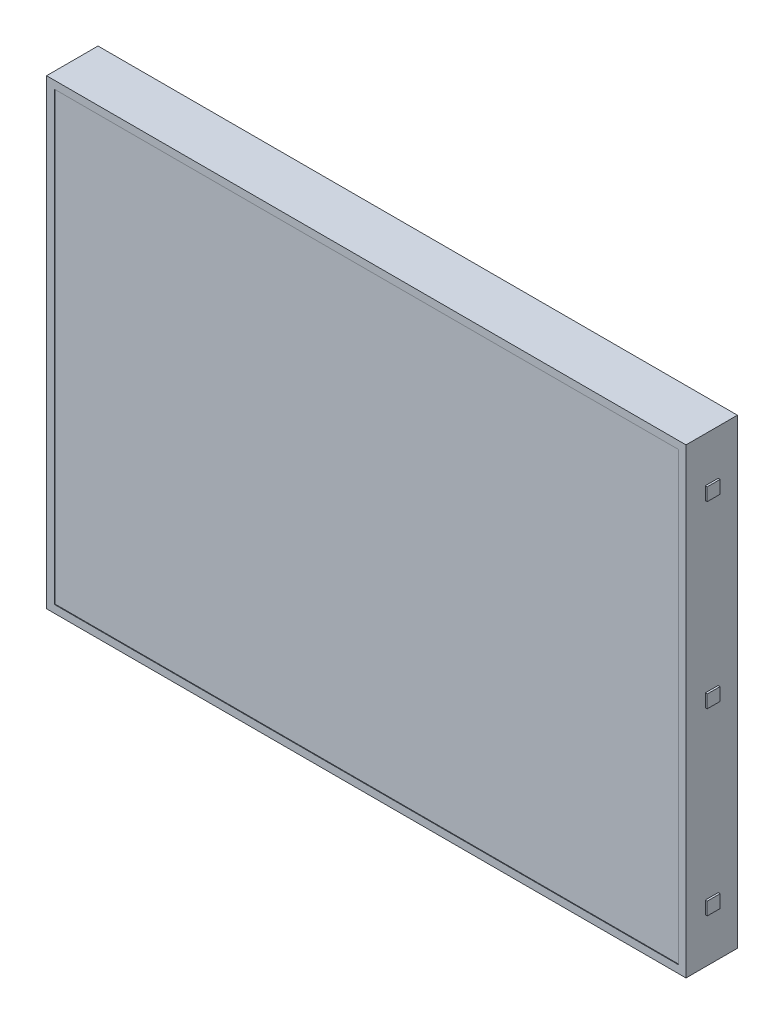
ISO-10303-21;
HEADER;
FILE_DESCRIPTION(('STEP AP214'),'2;1');
FILE_NAME('part.step','',(''),(''),'','','');
FILE_SCHEMA(('AUTOMOTIVE_DESIGN { 1 0 10303 214 1 1 1 1 }'));
ENDSEC;
DATA;
#1=APPLICATION_CONTEXT('core data for automotive mechanical design processes');
#2=APPLICATION_PROTOCOL_DEFINITION('international standard','automotive_design',2000,#1);
#3=PRODUCT_CONTEXT('',#1,'mechanical');
#4=PRODUCT('Part','Part','',(#3));
#5=PRODUCT_RELATED_PRODUCT_CATEGORY('part','',(#4));
#6=PRODUCT_DEFINITION_FORMATION('','',#4);
#7=PRODUCT_DEFINITION_CONTEXT('part definition',#1,'design');
#8=PRODUCT_DEFINITION('design','',#6,#7);
#9=PRODUCT_DEFINITION_SHAPE('','',#8);
#10=(LENGTH_UNIT() NAMED_UNIT(*) SI_UNIT(.MILLI.,.METRE.));
#11=(NAMED_UNIT(*) PLANE_ANGLE_UNIT() SI_UNIT($,.RADIAN.));
#12=(NAMED_UNIT(*) SI_UNIT($,.STERADIAN.) SOLID_ANGLE_UNIT());
#13=UNCERTAINTY_MEASURE_WITH_UNIT(LENGTH_MEASURE(1.E-05),#10,'distance_accuracy_value','');
#14=(GEOMETRIC_REPRESENTATION_CONTEXT(3) GLOBAL_UNCERTAINTY_ASSIGNED_CONTEXT((#13)) GLOBAL_UNIT_ASSIGNED_CONTEXT((#10,
#11,#12)) REPRESENTATION_CONTEXT('',''));
#15=CARTESIAN_POINT('',(0.,0.,0.));
#16=DIRECTION('',(0.,0.,1.));
#17=DIRECTION('',(1.,0.,0.));
#18=AXIS2_PLACEMENT_3D('',#15,#16,#17);
#19=CARTESIAN_POINT('',(-124.3,89.75,20.));
#20=DIRECTION('',(1.,0.,0.));
#21=DIRECTION('',(0.,1.,0.));
#22=AXIS2_PLACEMENT_3D('',#19,#20,#21);
#23=PLANE('',#22);
#24=CARTESIAN_POINT('',(-124.3,81.6317461319822,10.));
#25=DIRECTION('',(-1.,0.,0.));
#26=DIRECTION('',(0.,-1.,0.));
#27=AXIS2_PLACEMENT_3D('',#24,#25,#26);
#28=CIRCLE('',#27,2.75);
#29=CARTESIAN_POINT('',(-124.3,78.8817461319822,10.));
#30=VERTEX_POINT('',#29);
#31=EDGE_CURVE('E220',#30,#30,#28,.T.);
#32=ORIENTED_EDGE('',*,*,#31,.F.);
#33=EDGE_LOOP('',(#32));
#34=FACE_BOUND('',#33,.T.);
#35=DIRECTION('',(0.,-1.,0.));
#36=VECTOR('',#35,1.);
#37=CARTESIAN_POINT('',(-124.3,89.75,0.));
#38=LINE('',#37,#36);
#39=CARTESIAN_POINT('',(-124.3,89.75,0.));
#40=VERTEX_POINT('',#39);
#41=CARTESIAN_POINT('',(-124.3,-89.75,0.));
#42=VERTEX_POINT('',#41);
#43=EDGE_CURVE('E365',#40,#42,#38,.T.);
#44=ORIENTED_EDGE('',*,*,#43,.T.);
#45=DIRECTION('',(0.,0.,-1.));
#46=VECTOR('',#45,1.);
#47=CARTESIAN_POINT('',(-124.3,-89.75,20.));
#48=LINE('',#47,#46);
#49=CARTESIAN_POINT('',(-124.3,-89.75,20.));
#50=VERTEX_POINT('',#49);
#51=EDGE_CURVE('E412',#50,#42,#48,.T.);
#52=ORIENTED_EDGE('',*,*,#51,.F.);
#53=DIRECTION('',(0.,-1.,0.));
#54=VECTOR('',#53,1.);
#55=CARTESIAN_POINT('',(-124.3,89.75,20.));
#56=LINE('',#55,#54);
#57=CARTESIAN_POINT('',(-124.3,89.75,20.));
#58=VERTEX_POINT('',#57);
#59=EDGE_CURVE('E375',#58,#50,#56,.T.);
#60=ORIENTED_EDGE('',*,*,#59,.F.);
#61=DIRECTION('',(0.,0.,-1.));
#62=VECTOR('',#61,1.);
#63=CARTESIAN_POINT('',(-124.3,89.75,20.));
#64=LINE('',#63,#62);
#65=EDGE_CURVE('E389',#58,#40,#64,.T.);
#66=ORIENTED_EDGE('',*,*,#65,.T.);
#67=EDGE_LOOP('',(#44,#52,#60,#66));
#68=FACE_BOUND('',#67,.T.);
#69=ADVANCED_FACE('F51',(#34,#68),#23,.F.);
#70=CARTESIAN_POINT('',(124.3,-89.75,20.));
#71=DIRECTION('',(0.,1.,0.));
#72=DIRECTION('',(-1.,0.,0.));
#73=AXIS2_PLACEMENT_3D('',#70,#71,#72);
#74=PLANE('',#73);
#75=DIRECTION('',(1.,0.,0.));
#76=VECTOR('',#75,1.);
#77=CARTESIAN_POINT('',(124.3,-89.75,0.));
#78=LINE('',#77,#76);
#79=CARTESIAN_POINT('',(124.3,-89.75,0.));
#80=VERTEX_POINT('',#79);
#81=EDGE_CURVE('E393',#42,#80,#78,.T.);
#82=ORIENTED_EDGE('',*,*,#81,.T.);
#83=DIRECTION('',(0.,0.,-1.));
#84=VECTOR('',#83,1.);
#85=CARTESIAN_POINT('',(124.3,-89.75,20.));
#86=LINE('',#85,#84);
#87=CARTESIAN_POINT('',(124.3,-89.75,20.));
#88=VERTEX_POINT('',#87);
#89=EDGE_CURVE('E408',#88,#80,#86,.T.);
#90=ORIENTED_EDGE('',*,*,#89,.F.);
#91=DIRECTION('',(1.,0.,0.));
#92=VECTOR('',#91,1.);
#93=CARTESIAN_POINT('',(124.3,-89.75,20.));
#94=LINE('',#93,#92);
#95=EDGE_CURVE('E379',#50,#88,#94,.T.);
#96=ORIENTED_EDGE('',*,*,#95,.F.);
#97=ORIENTED_EDGE('',*,*,#51,.T.);
#98=EDGE_LOOP('',(#82,#90,#96,#97));
#99=FACE_BOUND('',#98,.T.);
#100=ADVANCED_FACE('F430',(#99),#74,.F.);
#101=CARTESIAN_POINT('',(124.3,89.75,20.));
#102=DIRECTION('',(-1.,0.,0.));
#103=DIRECTION('',(0.,-1.,0.));
#104=AXIS2_PLACEMENT_3D('',#101,#102,#103);
#105=PLANE('',#104);
#106=DIRECTION('',(0.,-1.,0.));
#107=VECTOR('',#106,1.);
#108=CARTESIAN_POINT('',(124.3,72.25,7.5));
#109=LINE('',#108,#107);
#110=CARTESIAN_POINT('',(124.3,72.25,7.5));
#111=VERTEX_POINT('',#110);
#112=CARTESIAN_POINT('',(124.3,67.25,7.5));
#113=VERTEX_POINT('',#112);
#114=EDGE_CURVE('E67',#111,#113,#109,.T.);
#115=ORIENTED_EDGE('',*,*,#114,.T.);
#116=DIRECTION('',(0.,0.,1.));
#117=VECTOR('',#116,1.);
#118=CARTESIAN_POINT('',(124.3,67.25,7.5));
#119=LINE('',#118,#117);
#120=CARTESIAN_POINT('',(124.3,67.25,12.5));
#121=VERTEX_POINT('',#120);
#122=EDGE_CURVE('E227',#113,#121,#119,.T.);
#123=ORIENTED_EDGE('',*,*,#122,.T.);
#124=DIRECTION('',(0.,-1.,0.));
#125=VECTOR('',#124,1.);
#126=CARTESIAN_POINT('',(124.3,72.25,12.5));
#127=LINE('',#126,#125);
#128=CARTESIAN_POINT('',(124.3,72.25,12.5));
#129=VERTEX_POINT('',#128);
#130=EDGE_CURVE('E206',#129,#121,#127,.T.);
#131=ORIENTED_EDGE('',*,*,#130,.F.);
#132=DIRECTION('',(0.,0.,1.));
#133=VECTOR('',#132,1.);
#134=CARTESIAN_POINT('',(124.3,72.25,7.5));
#135=LINE('',#134,#133);
#136=EDGE_CURVE('E72',#111,#129,#135,.T.);
#137=ORIENTED_EDGE('',*,*,#136,.F.);
#138=EDGE_LOOP('',(#115,#123,#131,#137));
#139=FACE_BOUND('',#138,.T.);
#140=DIRECTION('',(0.,-1.,0.));
#141=VECTOR('',#140,1.);
#142=CARTESIAN_POINT('',(124.3,2.50000000000002,7.49999999999999));
#143=LINE('',#142,#141);
#144=CARTESIAN_POINT('',(124.3,2.50000000000002,7.49999999999999));
#145=VERTEX_POINT('',#144);
#146=CARTESIAN_POINT('',(124.3,-2.49999999999999,7.49999999999999));
#147=VERTEX_POINT('',#146);
#148=EDGE_CURVE('E261',#145,#147,#143,.T.);
#149=ORIENTED_EDGE('',*,*,#148,.T.);
#150=DIRECTION('',(0.,0.,1.));
#151=VECTOR('',#150,1.);
#152=CARTESIAN_POINT('',(124.3,-2.49999999999998,7.49999999999999));
#153=LINE('',#152,#151);
#154=CARTESIAN_POINT('',(124.3,-2.49999999999998,12.5));
#155=VERTEX_POINT('',#154);
#156=EDGE_CURVE('E230',#147,#155,#153,.T.);
#157=ORIENTED_EDGE('',*,*,#156,.T.);
#158=DIRECTION('',(0.,-1.,0.));
#159=VECTOR('',#158,1.);
#160=CARTESIAN_POINT('',(124.3,2.50000000000002,12.5));
#161=LINE('',#160,#159);
#162=CARTESIAN_POINT('',(124.3,2.50000000000002,12.5));
#163=VERTEX_POINT('',#162);
#164=EDGE_CURVE('E269',#163,#155,#161,.T.);
#165=ORIENTED_EDGE('',*,*,#164,.F.);
#166=DIRECTION('',(0.,0.,1.));
#167=VECTOR('',#166,1.);
#168=CARTESIAN_POINT('',(124.3,2.50000000000002,7.49999999999999));
#169=LINE('',#168,#167);
#170=EDGE_CURVE('E264',#145,#163,#169,.T.);
#171=ORIENTED_EDGE('',*,*,#170,.F.);
#172=EDGE_LOOP('',(#149,#157,#165,#171));
#173=FACE_BOUND('',#172,.T.);
#174=DIRECTION('',(0.,-1.,0.));
#175=VECTOR('',#174,1.);
#176=CARTESIAN_POINT('',(124.3,-67.25,7.49999999999998));
#177=LINE('',#176,#175);
#178=CARTESIAN_POINT('',(124.3,-67.25,7.49999999999998));
#179=VERTEX_POINT('',#178);
#180=CARTESIAN_POINT('',(124.3,-72.25,7.49999999999998));
#181=VERTEX_POINT('',#180);
#182=EDGE_CURVE('E305',#179,#181,#177,.T.);
#183=ORIENTED_EDGE('',*,*,#182,.T.);
#184=DIRECTION('',(0.,0.,1.));
#185=VECTOR('',#184,1.);
#186=CARTESIAN_POINT('',(124.3,-72.25,7.49999999999998));
#187=LINE('',#186,#185);
#188=CARTESIAN_POINT('',(124.3,-72.25,12.5));
#189=VERTEX_POINT('',#188);
#190=EDGE_CURVE('E260',#181,#189,#187,.T.);
#191=ORIENTED_EDGE('',*,*,#190,.T.);
#192=DIRECTION('',(0.,-1.,0.));
#193=VECTOR('',#192,1.);
#194=CARTESIAN_POINT('',(124.3,-67.25,12.5));
#195=LINE('',#194,#193);
#196=CARTESIAN_POINT('',(124.3,-67.25,12.5));
#197=VERTEX_POINT('',#196);
#198=EDGE_CURVE('E313',#197,#189,#195,.T.);
#199=ORIENTED_EDGE('',*,*,#198,.F.);
#200=DIRECTION('',(0.,0.,1.));
#201=VECTOR('',#200,1.);
#202=CARTESIAN_POINT('',(124.3,-67.25,7.49999999999998));
#203=LINE('',#202,#201);
#204=EDGE_CURVE('E308',#179,#197,#203,.T.);
#205=ORIENTED_EDGE('',*,*,#204,.F.);
#206=EDGE_LOOP('',(#183,#191,#199,#205));
#207=FACE_BOUND('',#206,.T.);
#208=DIRECTION('',(0.,1.,0.));
#209=VECTOR('',#208,1.);
#210=CARTESIAN_POINT('',(124.3,89.75,0.));
#211=LINE('',#210,#209);
#212=CARTESIAN_POINT('',(124.3,89.75,0.));
#213=VERTEX_POINT('',#212);
#214=EDGE_CURVE('E396',#80,#213,#211,.T.);
#215=ORIENTED_EDGE('',*,*,#214,.T.);
#216=DIRECTION('',(0.,0.,-1.));
#217=VECTOR('',#216,1.);
#218=CARTESIAN_POINT('',(124.3,89.75,20.));
#219=LINE('',#218,#217);
#220=CARTESIAN_POINT('',(124.3,89.75,20.));
#221=VERTEX_POINT('',#220);
#222=EDGE_CURVE('E404',#221,#213,#219,.T.);
#223=ORIENTED_EDGE('',*,*,#222,.F.);
#224=DIRECTION('',(0.,1.,0.));
#225=VECTOR('',#224,1.);
#226=CARTESIAN_POINT('',(124.3,89.75,20.));
#227=LINE('',#226,#225);
#228=EDGE_CURVE('E383',#88,#221,#227,.T.);
#229=ORIENTED_EDGE('',*,*,#228,.F.);
#230=ORIENTED_EDGE('',*,*,#89,.T.);
#231=EDGE_LOOP('',(#215,#223,#229,#230));
#232=FACE_BOUND('',#231,.T.);
#233=ADVANCED_FACE('F435',(#139,#173,#207,#232),#105,.F.);
#234=CARTESIAN_POINT('',(124.3,89.75,20.));
#235=DIRECTION('',(0.,-1.,0.));
#236=DIRECTION('',(1.,0.,0.));
#237=AXIS2_PLACEMENT_3D('',#234,#235,#236);
#238=PLANE('',#237);
#239=DIRECTION('',(-1.,0.,0.));
#240=VECTOR('',#239,1.);
#241=CARTESIAN_POINT('',(124.3,89.75,0.));
#242=LINE('',#241,#240);
#243=EDGE_CURVE('E380',#213,#40,#242,.T.);
#244=ORIENTED_EDGE('',*,*,#243,.T.);
#245=ORIENTED_EDGE('',*,*,#65,.F.);
#246=DIRECTION('',(-1.,0.,0.));
#247=VECTOR('',#246,1.);
#248=CARTESIAN_POINT('',(124.3,89.75,20.));
#249=LINE('',#248,#247);
#250=EDGE_CURVE('E386',#221,#58,#249,.T.);
#251=ORIENTED_EDGE('',*,*,#250,.F.);
#252=ORIENTED_EDGE('',*,*,#222,.T.);
#253=EDGE_LOOP('',(#244,#245,#251,#252));
#254=FACE_BOUND('',#253,.T.);
#255=ADVANCED_FACE('F443',(#254),#238,.F.);
#256=CARTESIAN_POINT('',(0.,0.,20.));
#257=DIRECTION('',(0.,0.,-1.));
#258=DIRECTION('',(-1.,0.,0.));
#259=AXIS2_PLACEMENT_3D('',#256,#257,#258);
#260=PLANE('',#259);
#261=DIRECTION('',(1.,0.,0.));
#262=VECTOR('',#261,1.);
#263=CARTESIAN_POINT('',(121.3,-86.75,20.));
#264=LINE('',#263,#262);
#265=CARTESIAN_POINT('',(-121.3,-86.75,20.));
#266=VERTEX_POINT('',#265);
#267=CARTESIAN_POINT('',(121.3,-86.75,20.));
#268=VERTEX_POINT('',#267);
#269=EDGE_CURVE('E351',#266,#268,#264,.T.);
#270=ORIENTED_EDGE('',*,*,#269,.F.);
#271=DIRECTION('',(0.,-1.,0.));
#272=VECTOR('',#271,1.);
#273=CARTESIAN_POINT('',(-121.3,86.75,20.));
#274=LINE('',#273,#272);
#275=CARTESIAN_POINT('',(-121.3,86.75,20.));
#276=VERTEX_POINT('',#275);
#277=EDGE_CURVE('E237',#276,#266,#274,.T.);
#278=ORIENTED_EDGE('',*,*,#277,.F.);
#279=DIRECTION('',(-1.,0.,0.));
#280=VECTOR('',#279,1.);
#281=CARTESIAN_POINT('',(121.3,86.75,20.));
#282=LINE('',#281,#280);
#283=CARTESIAN_POINT('',(121.3,86.75,20.));
#284=VERTEX_POINT('',#283);
#285=EDGE_CURVE('E336',#284,#276,#282,.T.);
#286=ORIENTED_EDGE('',*,*,#285,.F.);
#287=DIRECTION('',(0.,1.,0.));
#288=VECTOR('',#287,1.);
#289=CARTESIAN_POINT('',(121.3,86.75,20.));
#290=LINE('',#289,#288);
#291=EDGE_CURVE('E355',#268,#284,#290,.T.);
#292=ORIENTED_EDGE('',*,*,#291,.F.);
#293=EDGE_LOOP('',(#270,#278,#286,#292));
#294=FACE_BOUND('',#293,.T.);
#295=ORIENTED_EDGE('',*,*,#59,.T.);
#296=ORIENTED_EDGE('',*,*,#95,.T.);
#297=ORIENTED_EDGE('',*,*,#228,.T.);
#298=ORIENTED_EDGE('',*,*,#250,.T.);
#299=EDGE_LOOP('',(#295,#296,#297,#298));
#300=FACE_BOUND('',#299,.T.);
#301=ADVANCED_FACE('F446',(#294,#300),#260,.F.);
#302=CARTESIAN_POINT('',(0.,0.,0.));
#303=DIRECTION('',(0.,0.,-1.));
#304=DIRECTION('',(-1.,0.,0.));
#305=AXIS2_PLACEMENT_3D('',#302,#303,#304);
#306=PLANE('',#305);
#307=ORIENTED_EDGE('',*,*,#43,.F.);
#308=ORIENTED_EDGE('',*,*,#243,.F.);
#309=ORIENTED_EDGE('',*,*,#214,.F.);
#310=ORIENTED_EDGE('',*,*,#81,.F.);
#311=EDGE_LOOP('',(#307,#308,#309,#310));
#312=FACE_BOUND('',#311,.T.);
#313=ADVANCED_FACE('F448',(#312),#306,.T.);
#314=CARTESIAN_POINT('',(-121.3,86.75,19.75));
#315=DIRECTION('',(-1.,0.,0.));
#316=DIRECTION('',(0.,0.,1.));
#317=AXIS2_PLACEMENT_3D('',#314,#315,#316);
#318=PLANE('',#317);
#319=ORIENTED_EDGE('',*,*,#277,.T.);
#320=DIRECTION('',(0.,0.,1.));
#321=VECTOR('',#320,1.);
#322=CARTESIAN_POINT('',(-121.3,-86.75,19.75));
#323=LINE('',#322,#321);
#324=CARTESIAN_POINT('',(-121.3,-86.75,19.75));
#325=VERTEX_POINT('',#324);
#326=EDGE_CURVE('E348',#325,#266,#323,.T.);
#327=ORIENTED_EDGE('',*,*,#326,.F.);
#328=DIRECTION('',(0.,-1.,0.));
#329=VECTOR('',#328,1.);
#330=CARTESIAN_POINT('',(-121.3,86.75,19.75));
#331=LINE('',#330,#329);
#332=CARTESIAN_POINT('',(-121.3,86.75,19.75));
#333=VERTEX_POINT('',#332);
#334=EDGE_CURVE('E331',#333,#325,#331,.T.);
#335=ORIENTED_EDGE('',*,*,#334,.F.);
#336=DIRECTION('',(0.,0.,1.));
#337=VECTOR('',#336,1.);
#338=CARTESIAN_POINT('',(-121.3,86.75,19.75));
#339=LINE('',#338,#337);
#340=EDGE_CURVE('E362',#333,#276,#339,.T.);
#341=ORIENTED_EDGE('',*,*,#340,.T.);
#342=EDGE_LOOP('',(#319,#327,#335,#341));
#343=FACE_BOUND('',#342,.T.);
#344=ADVANCED_FACE('F451',(#343),#318,.F.);
#345=CARTESIAN_POINT('',(121.3,86.75,19.75));
#346=DIRECTION('',(0.,1.,0.));
#347=DIRECTION('',(0.,0.,1.));
#348=AXIS2_PLACEMENT_3D('',#345,#346,#347);
#349=PLANE('',#348);
#350=ORIENTED_EDGE('',*,*,#285,.T.);
#351=ORIENTED_EDGE('',*,*,#340,.F.);
#352=DIRECTION('',(-1.,0.,0.));
#353=VECTOR('',#352,1.);
#354=CARTESIAN_POINT('',(121.3,86.75,19.75));
#355=LINE('',#354,#353);
#356=CARTESIAN_POINT('',(121.3,86.75,19.75));
#357=VERTEX_POINT('',#356);
#358=EDGE_CURVE('E344',#357,#333,#355,.T.);
#359=ORIENTED_EDGE('',*,*,#358,.F.);
#360=DIRECTION('',(0.,0.,1.));
#361=VECTOR('',#360,1.);
#362=CARTESIAN_POINT('',(121.3,86.75,19.75));
#363=LINE('',#362,#361);
#364=EDGE_CURVE('E366',#357,#284,#363,.T.);
#365=ORIENTED_EDGE('',*,*,#364,.T.);
#366=EDGE_LOOP('',(#350,#351,#359,#365));
#367=FACE_BOUND('',#366,.T.);
#368=ADVANCED_FACE('F458',(#367),#349,.F.);
#369=CARTESIAN_POINT('',(121.3,86.75,19.75));
#370=DIRECTION('',(1.,0.,0.));
#371=DIRECTION('',(0.,0.,-1.));
#372=AXIS2_PLACEMENT_3D('',#369,#370,#371);
#373=PLANE('',#372);
#374=ORIENTED_EDGE('',*,*,#291,.T.);
#375=ORIENTED_EDGE('',*,*,#364,.F.);
#376=DIRECTION('',(0.,1.,0.));
#377=VECTOR('',#376,1.);
#378=CARTESIAN_POINT('',(121.3,86.75,19.75));
#379=LINE('',#378,#377);
#380=CARTESIAN_POINT('',(121.3,-86.75,19.75));
#381=VERTEX_POINT('',#380);
#382=EDGE_CURVE('E340',#381,#357,#379,.T.);
#383=ORIENTED_EDGE('',*,*,#382,.F.);
#384=DIRECTION('',(0.,0.,1.));
#385=VECTOR('',#384,1.);
#386=CARTESIAN_POINT('',(121.3,-86.75,19.75));
#387=LINE('',#386,#385);
#388=EDGE_CURVE('E369',#381,#268,#387,.T.);
#389=ORIENTED_EDGE('',*,*,#388,.T.);
#390=EDGE_LOOP('',(#374,#375,#383,#389));
#391=FACE_BOUND('',#390,.T.);
#392=ADVANCED_FACE('F464',(#391),#373,.F.);
#393=CARTESIAN_POINT('',(121.3,-86.75,19.75));
#394=DIRECTION('',(0.,-1.,0.));
#395=DIRECTION('',(0.,0.,-1.));
#396=AXIS2_PLACEMENT_3D('',#393,#394,#395);
#397=PLANE('',#396);
#398=ORIENTED_EDGE('',*,*,#269,.T.);
#399=ORIENTED_EDGE('',*,*,#388,.F.);
#400=DIRECTION('',(1.,0.,0.));
#401=VECTOR('',#400,1.);
#402=CARTESIAN_POINT('',(121.3,-86.75,19.75));
#403=LINE('',#402,#401);
#404=EDGE_CURVE('E335',#325,#381,#403,.T.);
#405=ORIENTED_EDGE('',*,*,#404,.F.);
#406=ORIENTED_EDGE('',*,*,#326,.T.);
#407=EDGE_LOOP('',(#398,#399,#405,#406));
#408=FACE_BOUND('',#407,.T.);
#409=ADVANCED_FACE('F460',(#408),#397,.F.);
#410=CARTESIAN_POINT('',(0.,0.,19.75));
#411=DIRECTION('',(0.,0.,-1.));
#412=DIRECTION('',(-1.,0.,0.));
#413=AXIS2_PLACEMENT_3D('',#410,#411,#412);
#414=PLANE('',#413);
#415=ORIENTED_EDGE('',*,*,#334,.T.);
#416=ORIENTED_EDGE('',*,*,#404,.T.);
#417=ORIENTED_EDGE('',*,*,#382,.T.);
#418=ORIENTED_EDGE('',*,*,#358,.T.);
#419=EDGE_LOOP('',(#415,#416,#417,#418));
#420=FACE_BOUND('',#419,.T.);
#421=ADVANCED_FACE('F463',(#420),#414,.F.);
#422=CARTESIAN_POINT('',(125.05,-72.25,7.49999999999998));
#423=DIRECTION('',(0.,-1.,0.));
#424=DIRECTION('',(1.,0.,0.));
#425=AXIS2_PLACEMENT_3D('',#422,#423,#424);
#426=PLANE('',#425);
#427=ORIENTED_EDGE('',*,*,#190,.F.);
#428=DIRECTION('',(-1.,0.,0.));
#429=VECTOR('',#428,1.);
#430=CARTESIAN_POINT('',(125.05,-72.25,7.49999999999998));
#431=LINE('',#430,#429);
#432=CARTESIAN_POINT('',(125.05,-72.25,7.49999999999998));
#433=VERTEX_POINT('',#432);
#434=EDGE_CURVE('E300',#433,#181,#431,.T.);
#435=ORIENTED_EDGE('',*,*,#434,.F.);
#436=DIRECTION('',(0.,0.,1.));
#437=VECTOR('',#436,1.);
#438=CARTESIAN_POINT('',(125.05,-72.25,7.49999999999998));
#439=LINE('',#438,#437);
#440=CARTESIAN_POINT('',(125.05,-72.25,12.5));
#441=VERTEX_POINT('',#440);
#442=EDGE_CURVE('E309',#433,#441,#439,.T.);
#443=ORIENTED_EDGE('',*,*,#442,.T.);
#444=DIRECTION('',(-1.,0.,0.));
#445=VECTOR('',#444,1.);
#446=CARTESIAN_POINT('',(125.05,-72.25,12.5));
#447=LINE('',#446,#445);
#448=EDGE_CURVE('E287',#441,#189,#447,.T.);
#449=ORIENTED_EDGE('',*,*,#448,.T.);
#450=EDGE_LOOP('',(#427,#435,#443,#449));
#451=FACE_BOUND('',#450,.T.);
#452=ADVANCED_FACE('F474',(#451),#426,.T.);
#453=CARTESIAN_POINT('',(125.05,-67.25,7.49999999999998));
#454=DIRECTION('',(0.,0.,-1.));
#455=DIRECTION('',(0.,1.,0.));
#456=AXIS2_PLACEMENT_3D('',#453,#454,#455);
#457=PLANE('',#456);
#458=ORIENTED_EDGE('',*,*,#182,.F.);
#459=DIRECTION('',(-1.,0.,0.));
#460=VECTOR('',#459,1.);
#461=CARTESIAN_POINT('',(125.05,-67.25,7.49999999999998));
#462=LINE('',#461,#460);
#463=CARTESIAN_POINT('',(125.05,-67.25,7.49999999999998));
#464=VERTEX_POINT('',#463);
#465=EDGE_CURVE('E296',#464,#179,#462,.T.);
#466=ORIENTED_EDGE('',*,*,#465,.F.);
#467=DIRECTION('',(0.,-1.,0.));
#468=VECTOR('',#467,1.);
#469=CARTESIAN_POINT('',(125.05,-67.25,7.49999999999998));
#470=LINE('',#469,#468);
#471=EDGE_CURVE('E291',#464,#433,#470,.T.);
#472=ORIENTED_EDGE('',*,*,#471,.T.);
#473=ORIENTED_EDGE('',*,*,#434,.T.);
#474=EDGE_LOOP('',(#458,#466,#472,#473));
#475=FACE_BOUND('',#474,.T.);
#476=ADVANCED_FACE('F482',(#475),#457,.T.);
#477=CARTESIAN_POINT('',(125.05,-67.25,7.49999999999998));
#478=DIRECTION('',(0.,-1.,0.));
#479=DIRECTION('',(1.,0.,0.));
#480=AXIS2_PLACEMENT_3D('',#477,#478,#479);
#481=PLANE('',#480);
#482=ORIENTED_EDGE('',*,*,#204,.T.);
#483=DIRECTION('',(-1.,0.,0.));
#484=VECTOR('',#483,1.);
#485=CARTESIAN_POINT('',(125.05,-67.25,12.5));
#486=LINE('',#485,#484);
#487=CARTESIAN_POINT('',(125.05,-67.25,12.5));
#488=VERTEX_POINT('',#487);
#489=EDGE_CURVE('E292',#488,#197,#486,.T.);
#490=ORIENTED_EDGE('',*,*,#489,.F.);
#491=DIRECTION('',(0.,0.,1.));
#492=VECTOR('',#491,1.);
#493=CARTESIAN_POINT('',(125.05,-67.25,7.49999999999998));
#494=LINE('',#493,#492);
#495=EDGE_CURVE('E322',#464,#488,#494,.T.);
#496=ORIENTED_EDGE('',*,*,#495,.F.);
#497=ORIENTED_EDGE('',*,*,#465,.T.);
#498=EDGE_LOOP('',(#482,#490,#496,#497));
#499=FACE_BOUND('',#498,.T.);
#500=ADVANCED_FACE('F485',(#499),#481,.F.);
#501=CARTESIAN_POINT('',(125.05,-67.25,12.5));
#502=DIRECTION('',(0.,0.,-1.));
#503=DIRECTION('',(-1.,0.,0.));
#504=AXIS2_PLACEMENT_3D('',#501,#502,#503);
#505=PLANE('',#504);
#506=ORIENTED_EDGE('',*,*,#198,.T.);
#507=ORIENTED_EDGE('',*,*,#448,.F.);
#508=DIRECTION('',(0.,-1.,0.));
#509=VECTOR('',#508,1.);
#510=CARTESIAN_POINT('',(125.05,-67.25,12.5));
#511=LINE('',#510,#509);
#512=EDGE_CURVE('E325',#488,#441,#511,.T.);
#513=ORIENTED_EDGE('',*,*,#512,.F.);
#514=ORIENTED_EDGE('',*,*,#489,.T.);
#515=EDGE_LOOP('',(#506,#507,#513,#514));
#516=FACE_BOUND('',#515,.T.);
#517=ADVANCED_FACE('F480',(#516),#505,.F.);
#518=CARTESIAN_POINT('',(125.05,0.,0.));
#519=DIRECTION('',(1.,0.,0.));
#520=DIRECTION('',(0.,0.,-1.));
#521=AXIS2_PLACEMENT_3D('',#518,#519,#520);
#522=PLANE('',#521);
#523=ORIENTED_EDGE('',*,*,#442,.F.);
#524=ORIENTED_EDGE('',*,*,#471,.F.);
#525=ORIENTED_EDGE('',*,*,#495,.T.);
#526=ORIENTED_EDGE('',*,*,#512,.T.);
#527=EDGE_LOOP('',(#523,#524,#525,#526));
#528=FACE_BOUND('',#527,.T.);
#529=ADVANCED_FACE('F476',(#528),#522,.T.);
#530=CARTESIAN_POINT('',(125.05,-2.49999999999998,7.49999999999999));
#531=DIRECTION('',(0.,-1.,0.));
#532=DIRECTION('',(1.,0.,0.));
#533=AXIS2_PLACEMENT_3D('',#530,#531,#532);
#534=PLANE('',#533);
#535=ORIENTED_EDGE('',*,*,#156,.F.);
#536=DIRECTION('',(-1.,0.,0.));
#537=VECTOR('',#536,1.);
#538=CARTESIAN_POINT('',(125.05,-2.49999999999998,7.49999999999999));
#539=LINE('',#538,#537);
#540=CARTESIAN_POINT('',(125.05,-2.49999999999998,7.49999999999999));
#541=VERTEX_POINT('',#540);
#542=EDGE_CURVE('E256',#541,#147,#539,.T.);
#543=ORIENTED_EDGE('',*,*,#542,.F.);
#544=DIRECTION('',(0.,0.,1.));
#545=VECTOR('',#544,1.);
#546=CARTESIAN_POINT('',(125.05,-2.49999999999998,7.49999999999999));
#547=LINE('',#546,#545);
#548=CARTESIAN_POINT('',(125.05,-2.49999999999998,12.5));
#549=VERTEX_POINT('',#548);
#550=EDGE_CURVE('E265',#541,#549,#547,.T.);
#551=ORIENTED_EDGE('',*,*,#550,.T.);
#552=DIRECTION('',(-1.,0.,0.));
#553=VECTOR('',#552,1.);
#554=CARTESIAN_POINT('',(125.05,-2.49999999999998,12.5));
#555=LINE('',#554,#553);
#556=EDGE_CURVE('E243',#549,#155,#555,.T.);
#557=ORIENTED_EDGE('',*,*,#556,.T.);
#558=EDGE_LOOP('',(#535,#543,#551,#557));
#559=FACE_BOUND('',#558,.T.);
#560=ADVANCED_FACE('F479',(#559),#534,.T.);
#561=CARTESIAN_POINT('',(125.05,2.50000000000002,7.49999999999999));
#562=DIRECTION('',(0.,0.,-1.));
#563=DIRECTION('',(0.,1.,0.));
#564=AXIS2_PLACEMENT_3D('',#561,#562,#563);
#565=PLANE('',#564);
#566=ORIENTED_EDGE('',*,*,#148,.F.);
#567=DIRECTION('',(-1.,0.,0.));
#568=VECTOR('',#567,1.);
#569=CARTESIAN_POINT('',(125.05,2.50000000000002,7.49999999999999));
#570=LINE('',#569,#568);
#571=CARTESIAN_POINT('',(125.05,2.50000000000002,7.49999999999999));
#572=VERTEX_POINT('',#571);
#573=EDGE_CURVE('E252',#572,#145,#570,.T.);
#574=ORIENTED_EDGE('',*,*,#573,.F.);
#575=DIRECTION('',(0.,-1.,0.));
#576=VECTOR('',#575,1.);
#577=CARTESIAN_POINT('',(125.05,2.50000000000002,7.49999999999999));
#578=LINE('',#577,#576);
#579=EDGE_CURVE('E247',#572,#541,#578,.T.);
#580=ORIENTED_EDGE('',*,*,#579,.T.);
#581=ORIENTED_EDGE('',*,*,#542,.T.);
#582=EDGE_LOOP('',(#566,#574,#580,#581));
#583=FACE_BOUND('',#582,.T.);
#584=ADVANCED_FACE('F501',(#583),#565,.T.);
#585=CARTESIAN_POINT('',(125.05,2.50000000000002,7.49999999999999));
#586=DIRECTION('',(0.,-1.,0.));
#587=DIRECTION('',(1.,0.,0.));
#588=AXIS2_PLACEMENT_3D('',#585,#586,#587);
#589=PLANE('',#588);
#590=ORIENTED_EDGE('',*,*,#170,.T.);
#591=DIRECTION('',(-1.,0.,0.));
#592=VECTOR('',#591,1.);
#593=CARTESIAN_POINT('',(125.05,2.50000000000002,12.5));
#594=LINE('',#593,#592);
#595=CARTESIAN_POINT('',(125.05,2.50000000000002,12.5));
#596=VERTEX_POINT('',#595);
#597=EDGE_CURVE('E248',#596,#163,#594,.T.);
#598=ORIENTED_EDGE('',*,*,#597,.F.);
#599=DIRECTION('',(0.,0.,1.));
#600=VECTOR('',#599,1.);
#601=CARTESIAN_POINT('',(125.05,2.50000000000002,7.49999999999999));
#602=LINE('',#601,#600);
#603=EDGE_CURVE('E278',#572,#596,#602,.T.);
#604=ORIENTED_EDGE('',*,*,#603,.F.);
#605=ORIENTED_EDGE('',*,*,#573,.T.);
#606=EDGE_LOOP('',(#590,#598,#604,#605));
#607=FACE_BOUND('',#606,.T.);
#608=ADVANCED_FACE('F504',(#607),#589,.F.);
#609=CARTESIAN_POINT('',(125.05,2.50000000000002,12.5));
#610=DIRECTION('',(0.,0.,-1.));
#611=DIRECTION('',(-1.,0.,0.));
#612=AXIS2_PLACEMENT_3D('',#609,#610,#611);
#613=PLANE('',#612);
#614=ORIENTED_EDGE('',*,*,#164,.T.);
#615=ORIENTED_EDGE('',*,*,#556,.F.);
#616=DIRECTION('',(0.,-1.,0.));
#617=VECTOR('',#616,1.);
#618=CARTESIAN_POINT('',(125.05,2.50000000000002,12.5));
#619=LINE('',#618,#617);
#620=EDGE_CURVE('E281',#596,#549,#619,.T.);
#621=ORIENTED_EDGE('',*,*,#620,.F.);
#622=ORIENTED_EDGE('',*,*,#597,.T.);
#623=EDGE_LOOP('',(#614,#615,#621,#622));
#624=FACE_BOUND('',#623,.T.);
#625=ADVANCED_FACE('F499',(#624),#613,.F.);
#626=CARTESIAN_POINT('',(125.05,0.,0.));
#627=DIRECTION('',(1.,0.,0.));
#628=DIRECTION('',(0.,0.,-1.));
#629=AXIS2_PLACEMENT_3D('',#626,#627,#628);
#630=PLANE('',#629);
#631=ORIENTED_EDGE('',*,*,#550,.F.);
#632=ORIENTED_EDGE('',*,*,#579,.F.);
#633=ORIENTED_EDGE('',*,*,#603,.T.);
#634=ORIENTED_EDGE('',*,*,#620,.T.);
#635=EDGE_LOOP('',(#631,#632,#633,#634));
#636=FACE_BOUND('',#635,.T.);
#637=ADVANCED_FACE('F496',(#636),#630,.T.);
#638=CARTESIAN_POINT('',(125.05,67.25,7.5));
#639=DIRECTION('',(0.,-1.,0.));
#640=DIRECTION('',(1.,0.,0.));
#641=AXIS2_PLACEMENT_3D('',#638,#639,#640);
#642=PLANE('',#641);
#643=ORIENTED_EDGE('',*,*,#122,.F.);
#644=DIRECTION('',(-1.,0.,0.));
#645=VECTOR('',#644,1.);
#646=CARTESIAN_POINT('',(125.05,67.25,7.5));
#647=LINE('',#646,#645);
#648=CARTESIAN_POINT('',(125.05,67.25,7.5));
#649=VERTEX_POINT('',#648);
#650=EDGE_CURVE('E214',#649,#113,#647,.T.);
#651=ORIENTED_EDGE('',*,*,#650,.F.);
#652=DIRECTION('',(0.,0.,1.));
#653=VECTOR('',#652,1.);
#654=CARTESIAN_POINT('',(125.05,67.25,7.5));
#655=LINE('',#654,#653);
#656=CARTESIAN_POINT('',(125.05,67.25,12.5));
#657=VERTEX_POINT('',#656);
#658=EDGE_CURVE('E193',#649,#657,#655,.T.);
#659=ORIENTED_EDGE('',*,*,#658,.T.);
#660=DIRECTION('',(-1.,0.,0.));
#661=VECTOR('',#660,1.);
#662=CARTESIAN_POINT('',(125.05,67.25,12.5));
#663=LINE('',#662,#661);
#664=EDGE_CURVE('E204',#657,#121,#663,.T.);
#665=ORIENTED_EDGE('',*,*,#664,.T.);
#666=EDGE_LOOP('',(#643,#651,#659,#665));
#667=FACE_BOUND('',#666,.T.);
#668=ADVANCED_FACE('F213',(#667),#642,.T.);
#669=CARTESIAN_POINT('',(125.05,72.25,7.5));
#670=DIRECTION('',(0.,0.,-1.));
#671=DIRECTION('',(-1.,0.,0.));
#672=AXIS2_PLACEMENT_3D('',#669,#670,#671);
#673=PLANE('',#672);
#674=ORIENTED_EDGE('',*,*,#114,.F.);
#675=DIRECTION('',(-1.,0.,0.));
#676=VECTOR('',#675,1.);
#677=CARTESIAN_POINT('',(125.05,72.25,7.5));
#678=LINE('',#677,#676);
#679=CARTESIAN_POINT('',(125.05,72.25,7.5));
#680=VERTEX_POINT('',#679);
#681=EDGE_CURVE('E238',#680,#111,#678,.T.);
#682=ORIENTED_EDGE('',*,*,#681,.F.);
#683=DIRECTION('',(0.,-1.,0.));
#684=VECTOR('',#683,1.);
#685=CARTESIAN_POINT('',(125.05,72.25,7.5));
#686=LINE('',#685,#684);
#687=EDGE_CURVE('E211',#680,#649,#686,.T.);
#688=ORIENTED_EDGE('',*,*,#687,.T.);
#689=ORIENTED_EDGE('',*,*,#650,.T.);
#690=EDGE_LOOP('',(#674,#682,#688,#689));
#691=FACE_BOUND('',#690,.T.);
#692=ADVANCED_FACE('F517',(#691),#673,.T.);
#693=CARTESIAN_POINT('',(125.05,72.25,7.5));
#694=DIRECTION('',(0.,-1.,0.));
#695=DIRECTION('',(1.,0.,0.));
#696=AXIS2_PLACEMENT_3D('',#693,#694,#695);
#697=PLANE('',#696);
#698=ORIENTED_EDGE('',*,*,#136,.T.);
#699=DIRECTION('',(-1.,0.,0.));
#700=VECTOR('',#699,1.);
#701=CARTESIAN_POINT('',(125.05,72.25,12.5));
#702=LINE('',#701,#700);
#703=CARTESIAN_POINT('',(125.05,72.25,12.5));
#704=VERTEX_POINT('',#703);
#705=EDGE_CURVE('E210',#704,#129,#702,.T.);
#706=ORIENTED_EDGE('',*,*,#705,.F.);
#707=DIRECTION('',(0.,0.,1.));
#708=VECTOR('',#707,1.);
#709=CARTESIAN_POINT('',(125.05,72.25,7.5));
#710=LINE('',#709,#708);
#711=EDGE_CURVE('E196',#680,#704,#710,.T.);
#712=ORIENTED_EDGE('',*,*,#711,.F.);
#713=ORIENTED_EDGE('',*,*,#681,.T.);
#714=EDGE_LOOP('',(#698,#706,#712,#713));
#715=FACE_BOUND('',#714,.T.);
#716=ADVANCED_FACE('F520',(#715),#697,.F.);
#717=CARTESIAN_POINT('',(125.05,72.25,12.5));
#718=DIRECTION('',(0.,0.,-1.));
#719=DIRECTION('',(-1.,0.,0.));
#720=AXIS2_PLACEMENT_3D('',#717,#718,#719);
#721=PLANE('',#720);
#722=ORIENTED_EDGE('',*,*,#130,.T.);
#723=ORIENTED_EDGE('',*,*,#664,.F.);
#724=DIRECTION('',(0.,-1.,0.));
#725=VECTOR('',#724,1.);
#726=CARTESIAN_POINT('',(125.05,72.25,12.5));
#727=LINE('',#726,#725);
#728=EDGE_CURVE('E188',#704,#657,#727,.T.);
#729=ORIENTED_EDGE('',*,*,#728,.F.);
#730=ORIENTED_EDGE('',*,*,#705,.T.);
#731=EDGE_LOOP('',(#722,#723,#729,#730));
#732=FACE_BOUND('',#731,.T.);
#733=ADVANCED_FACE('F205',(#732),#721,.F.);
#734=CARTESIAN_POINT('',(125.05,0.,0.));
#735=DIRECTION('',(1.,0.,0.));
#736=DIRECTION('',(0.,0.,-1.));
#737=AXIS2_PLACEMENT_3D('',#734,#735,#736);
#738=PLANE('',#737);
#739=ORIENTED_EDGE('',*,*,#658,.F.);
#740=ORIENTED_EDGE('',*,*,#687,.F.);
#741=ORIENTED_EDGE('',*,*,#711,.T.);
#742=ORIENTED_EDGE('',*,*,#728,.T.);
#743=EDGE_LOOP('',(#739,#740,#741,#742));
#744=FACE_BOUND('',#743,.T.);
#745=ADVANCED_FACE('F190',(#744),#738,.T.);
#746=CARTESIAN_POINT('',(-115.3,81.6317461319822,10.));
#747=DIRECTION('',(-1.,0.,0.));
#748=DIRECTION('',(0.,-1.,0.));
#749=AXIS2_PLACEMENT_3D('',#746,#747,#748);
#750=CYLINDRICAL_SURFACE('',#749,2.75);
#751=CARTESIAN_POINT('',(-115.3,81.6317461319822,10.));
#752=DIRECTION('',(-1.,0.,0.));
#753=DIRECTION('',(0.,-1.,0.));
#754=AXIS2_PLACEMENT_3D('',#751,#752,#753);
#755=CIRCLE('',#754,2.75);
#756=CARTESIAN_POINT('',(-115.3,78.8817461319822,10.));
#757=VERTEX_POINT('',#756);
#758=EDGE_CURVE('E304',#757,#757,#755,.T.);
#759=ORIENTED_EDGE('',*,*,#758,.F.);
#760=EDGE_LOOP('',(#759));
#761=FACE_BOUND('',#760,.T.);
#762=ORIENTED_EDGE('',*,*,#31,.T.);
#763=EDGE_LOOP('',(#762));
#764=FACE_BOUND('',#763,.T.);
#765=ADVANCED_FACE('F529',(#761,#764),#750,.F.);
#766=CARTESIAN_POINT('',(-115.3,81.6317461319822,10.));
#767=DIRECTION('',(-1.,0.,0.));
#768=DIRECTION('',(0.,-1.,0.));
#769=AXIS2_PLACEMENT_3D('',#766,#767,#768);
#770=PLANE('',#769);
#771=CARTESIAN_POINT('',(-115.3,81.6317461319822,10.));
#772=DIRECTION('',(-1.,0.,0.));
#773=DIRECTION('',(0.,-1.,0.));
#774=AXIS2_PLACEMENT_3D('',#771,#772,#773);
#775=CIRCLE('',#774,1.05);
#776=CARTESIAN_POINT('',(-115.3,80.5817461319822,10.));
#777=VERTEX_POINT('',#776);
#778=EDGE_CURVE('E544',#777,#777,#775,.T.);
#779=ORIENTED_EDGE('',*,*,#778,.F.);
#780=EDGE_LOOP('',(#779));
#781=FACE_BOUND('',#780,.T.);
#782=ORIENTED_EDGE('',*,*,#758,.T.);
#783=EDGE_LOOP('',(#782));
#784=FACE_BOUND('',#783,.T.);
#785=ADVANCED_FACE('F532',(#781,#784),#770,.T.);
#786=CARTESIAN_POINT('',(-121.3,81.6317461319822,10.));
#787=DIRECTION('',(1.,0.,0.));
#788=DIRECTION('',(0.,1.,0.));
#789=AXIS2_PLACEMENT_3D('',#786,#787,#788);
#790=CYLINDRICAL_SURFACE('',#789,1.05);
#791=CARTESIAN_POINT('',(-121.05,81.6317461319822,10.));
#792=DIRECTION('',(-1.,0.,0.));
#793=DIRECTION('',(0.,-1.,0.));
#794=AXIS2_PLACEMENT_3D('',#791,#792,#793);
#795=CIRCLE('',#794,1.05);
#796=CARTESIAN_POINT('',(-121.05,80.5817461319822,10.));
#797=VERTEX_POINT('',#796);
#798=EDGE_CURVE('E11',#797,#797,#795,.F.);
#799=ORIENTED_EDGE('',*,*,#798,.T.);
#800=EDGE_LOOP('',(#799));
#801=FACE_BOUND('',#800,.T.);
#802=ORIENTED_EDGE('',*,*,#778,.T.);
#803=EDGE_LOOP('',(#802));
#804=FACE_BOUND('',#803,.T.);
#805=ADVANCED_FACE('F426',(#801,#804),#790,.T.);
#806=CARTESIAN_POINT('',(-121.3,81.6317461319822,10.));
#807=DIRECTION('',(-1.,0.,0.));
#808=DIRECTION('',(0.,-1.,0.));
#809=AXIS2_PLACEMENT_3D('',#806,#807,#808);
#810=PLANE('',#809);
#811=CARTESIAN_POINT('',(-121.3,81.6317461319822,10.));
#812=DIRECTION('',(-1.,0.,0.));
#813=DIRECTION('',(0.,-1.,0.));
#814=AXIS2_PLACEMENT_3D('',#811,#812,#813);
#815=CIRCLE('',#814,0.799999999999999);
#816=CARTESIAN_POINT('',(-121.3,80.8317461319822,10.));
#817=VERTEX_POINT('',#816);
#818=EDGE_CURVE('E60',#817,#817,#815,.T.);
#819=ORIENTED_EDGE('',*,*,#818,.T.);
#820=EDGE_LOOP('',(#819));
#821=FACE_BOUND('',#820,.T.);
#822=ADVANCED_FACE('F419',(#821),#810,.T.);
#823=CARTESIAN_POINT('',(-121.05,81.6317461319822,10.));
#824=DIRECTION('',(-1.,0.,0.));
#825=DIRECTION('',(0.,-1.,0.));
#826=AXIS2_PLACEMENT_3D('',#823,#824,#825);
#827=TOROIDAL_SURFACE('',#826,0.799999999999999,0.25);
#828=ORIENTED_EDGE('',*,*,#798,.F.);
#829=EDGE_LOOP('',(#828));
#830=FACE_BOUND('',#829,.T.);
#831=ORIENTED_EDGE('',*,*,#818,.F.);
#832=EDGE_LOOP('',(#831));
#833=FACE_BOUND('',#832,.T.);
#834=ADVANCED_FACE('F53',(#830,#833),#827,.T.);
#835=CLOSED_SHELL('',(#69,#100,#233,#255,#301,#313,#344,#368,#392,#409,#421,#452,#476,#500,#517,
#529,#560,#584,#608,#625,#637,#668,#692,#716,#733,#745,#765,#785,#805,#822,#834));
#836=MANIFOLD_SOLID_BREP('B2',#835);
#837=ADVANCED_BREP_SHAPE_REPRESENTATION('',(#18,#836),#14);
#838=SHAPE_DEFINITION_REPRESENTATION(#9,#837);
ENDSEC;
END-ISO-10303-21;
